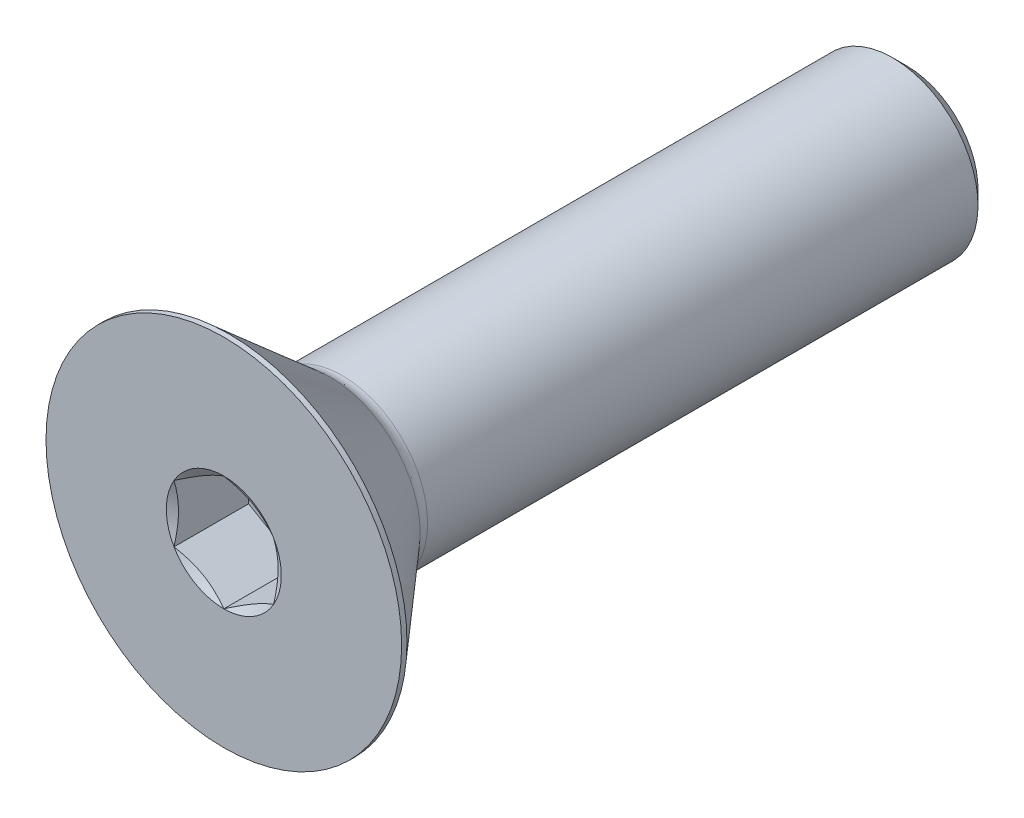
ISO-10303-21;
HEADER;
FILE_DESCRIPTION(('STEP AP214'),'2;1');
FILE_NAME('part.step','',(''),(''),'','','');
FILE_SCHEMA(('AUTOMOTIVE_DESIGN { 1 0 10303 214 1 1 1 1 }'));
ENDSEC;
DATA;
#1=APPLICATION_CONTEXT('core data for automotive mechanical design processes');
#2=APPLICATION_PROTOCOL_DEFINITION('international standard','automotive_design',2000,#1);
#3=PRODUCT_CONTEXT('',#1,'mechanical');
#4=PRODUCT('Part','Part','',(#3));
#5=PRODUCT_RELATED_PRODUCT_CATEGORY('part','',(#4));
#6=PRODUCT_DEFINITION_FORMATION('','',#4);
#7=PRODUCT_DEFINITION_CONTEXT('part definition',#1,'design');
#8=PRODUCT_DEFINITION('design','',#6,#7);
#9=PRODUCT_DEFINITION_SHAPE('','',#8);
#10=(LENGTH_UNIT() NAMED_UNIT(*) SI_UNIT(.MILLI.,.METRE.));
#11=(NAMED_UNIT(*) PLANE_ANGLE_UNIT() SI_UNIT($,.RADIAN.));
#12=(NAMED_UNIT(*) SI_UNIT($,.STERADIAN.) SOLID_ANGLE_UNIT());
#13=UNCERTAINTY_MEASURE_WITH_UNIT(LENGTH_MEASURE(1.E-05),#10,'distance_accuracy_value','');
#14=(GEOMETRIC_REPRESENTATION_CONTEXT(3) GLOBAL_UNCERTAINTY_ASSIGNED_CONTEXT((#13)) GLOBAL_UNIT_ASSIGNED_CONTEXT((#10,
#11,#12)) REPRESENTATION_CONTEXT('',''));
#15=CARTESIAN_POINT('',(0.,0.,0.));
#16=DIRECTION('',(0.,0.,1.));
#17=DIRECTION('',(1.,0.,0.));
#18=AXIS2_PLACEMENT_3D('',#15,#16,#17);
#19=CARTESIAN_POINT('',(0.,0.,-38.1));
#20=DIRECTION('',(0.,0.,-1.));
#21=DIRECTION('',(0.,1.,0.));
#22=AXIS2_PLACEMENT_3D('',#19,#20,#21);
#23=CYLINDRICAL_SURFACE('',#22,4.7625);
#24=CARTESIAN_POINT('',(0.,0.,-37.30625));
#25=DIRECTION('',(0.,0.,-1.));
#26=DIRECTION('',(0.,1.,0.));
#27=AXIS2_PLACEMENT_3D('',#24,#25,#26);
#28=CIRCLE('',#27,4.7625);
#29=CARTESIAN_POINT('',(0.,4.7625,-37.30625));
#30=VERTEX_POINT('',#29);
#31=EDGE_CURVE('E50',#30,#30,#28,.F.);
#32=ORIENTED_EDGE('',*,*,#31,.T.);
#33=EDGE_LOOP('',(#32));
#34=FACE_BOUND('',#33,.T.);
#35=CARTESIAN_POINT('',(0.,0.,-6.60648348108084));
#36=DIRECTION('',(0.,0.,1.));
#37=DIRECTION('',(0.,-1.,0.));
#38=AXIS2_PLACEMENT_3D('',#35,#36,#37);
#39=CIRCLE('',#38,4.7625);
#40=CARTESIAN_POINT('',(0.,-4.7625,-6.60648348108084));
#41=VERTEX_POINT('',#40);
#42=EDGE_CURVE('E209',#41,#41,#39,.T.);
#43=ORIENTED_EDGE('',*,*,#42,.F.);
#44=EDGE_LOOP('',(#43));
#45=FACE_BOUND('',#44,.T.);
#46=ADVANCED_FACE('F37',(#34,#45),#23,.T.);
#47=CARTESIAN_POINT('',(0.,-4.7625,-38.1));
#48=DIRECTION('',(0.,0.,-1.));
#49=DIRECTION('',(0.,1.,0.));
#50=AXIS2_PLACEMENT_3D('',#47,#48,#49);
#51=PLANE('',#50);
#52=CARTESIAN_POINT('',(0.,0.,-38.1));
#53=DIRECTION('',(0.,0.,-1.));
#54=DIRECTION('',(0.,1.,0.));
#55=AXIS2_PLACEMENT_3D('',#52,#53,#54);
#56=CIRCLE('',#55,3.96875);
#57=CARTESIAN_POINT('',(0.,3.96875,-38.1));
#58=VERTEX_POINT('',#57);
#59=EDGE_CURVE('E212',#58,#58,#56,.T.);
#60=ORIENTED_EDGE('',*,*,#59,.T.);
#61=EDGE_LOOP('',(#60));
#62=FACE_BOUND('',#61,.T.);
#63=ADVANCED_FACE('F222',(#62),#51,.T.);
#64=CARTESIAN_POINT('',(0.,0.,-38.1));
#65=DIRECTION('',(0.,0.,1.));
#66=DIRECTION('',(0.,-1.,0.));
#67=AXIS2_PLACEMENT_3D('',#64,#65,#66);
#68=CONICAL_SURFACE('',#67,3.96875,0.785398163397452);
#69=ORIENTED_EDGE('',*,*,#31,.F.);
#70=EDGE_LOOP('',(#69));
#71=FACE_BOUND('',#70,.T.);
#72=ORIENTED_EDGE('',*,*,#59,.F.);
#73=EDGE_LOOP('',(#72));
#74=FACE_BOUND('',#73,.T.);
#75=ADVANCED_FACE('F39',(#71,#74),#68,.T.);
#76=CARTESIAN_POINT('',(0.,0.,-6.60648348108084));
#77=DIRECTION('',(0.,0.,1.));
#78=DIRECTION('',(0.,-1.,0.));
#79=AXIS2_PLACEMENT_3D('',#76,#77,#78);
#80=TOROIDAL_SURFACE('',#79,5.77290219216377,1.01040219216376);
#81=CARTESIAN_POINT('',(0.,0.,-5.9436));
#82=DIRECTION('',(0.,0.,1.));
#83=DIRECTION('',(0.,-1.,0.));
#84=AXIS2_PLACEMENT_3D('',#81,#82,#83);
#85=CIRCLE('',#84,5.01034197785968);
#86=CARTESIAN_POINT('',(0.,-5.01034197785968,-5.9436));
#87=VERTEX_POINT('',#86);
#88=EDGE_CURVE('E206',#87,#87,#85,.T.);
#89=ORIENTED_EDGE('',*,*,#88,.F.);
#90=EDGE_LOOP('',(#89));
#91=FACE_BOUND('',#90,.T.);
#92=ORIENTED_EDGE('',*,*,#42,.T.);
#93=EDGE_LOOP('',(#92));
#94=FACE_BOUND('',#93,.T.);
#95=ADVANCED_FACE('F221',(#91,#94),#80,.F.);
#96=CARTESIAN_POINT('',(0.,0.,-5.9436));
#97=DIRECTION('',(0.,0.,1.));
#98=DIRECTION('',(0.,-1.,0.));
#99=AXIS2_PLACEMENT_3D('',#96,#97,#98);
#100=CONICAL_SURFACE('',#99,5.01034197785968,0.715584993317677);
#101=CARTESIAN_POINT('',(0.,0.,-0.297179999999999));
#102=DIRECTION('',(0.,0.,1.));
#103=DIRECTION('',(0.,-1.,0.));
#104=AXIS2_PLACEMENT_3D('',#101,#102,#103);
#105=CIRCLE('',#104,9.9187);
#106=CARTESIAN_POINT('',(0.,-9.9187,-0.297179999999999));
#107=VERTEX_POINT('',#106);
#108=EDGE_CURVE('E203',#107,#107,#105,.T.);
#109=ORIENTED_EDGE('',*,*,#108,.F.);
#110=EDGE_LOOP('',(#109));
#111=FACE_BOUND('',#110,.T.);
#112=ORIENTED_EDGE('',*,*,#88,.T.);
#113=EDGE_LOOP('',(#112));
#114=FACE_BOUND('',#113,.T.);
#115=ADVANCED_FACE('F234',(#111,#114),#100,.T.);
#116=CARTESIAN_POINT('',(0.,0.,0.));
#117=DIRECTION('',(0.,0.,1.));
#118=DIRECTION('',(0.,-1.,0.));
#119=AXIS2_PLACEMENT_3D('',#116,#117,#118);
#120=CYLINDRICAL_SURFACE('',#119,9.9187);
#121=CARTESIAN_POINT('',(0.,0.,0.));
#122=DIRECTION('',(0.,0.,1.));
#123=DIRECTION('',(0.,-1.,0.));
#124=AXIS2_PLACEMENT_3D('',#121,#122,#123);
#125=CIRCLE('',#124,9.9187);
#126=CARTESIAN_POINT('',(0.,-9.9187,0.));
#127=VERTEX_POINT('',#126);
#128=EDGE_CURVE('E191',#127,#127,#125,.T.);
#129=ORIENTED_EDGE('',*,*,#128,.F.);
#130=EDGE_LOOP('',(#129));
#131=FACE_BOUND('',#130,.T.);
#132=ORIENTED_EDGE('',*,*,#108,.T.);
#133=EDGE_LOOP('',(#132));
#134=FACE_BOUND('',#133,.T.);
#135=ADVANCED_FACE('F166',(#131,#134),#120,.T.);
#136=CARTESIAN_POINT('',(0.,-4.7625,0.));
#137=DIRECTION('',(0.,0.,1.));
#138=DIRECTION('',(0.,-1.,0.));
#139=AXIS2_PLACEMENT_3D('',#136,#137,#138);
#140=PLANE('',#139);
#141=CARTESIAN_POINT('',(0.,0.,0.));
#142=DIRECTION('',(0.,0.,1.));
#143=DIRECTION('',(1.,0.,0.));
#144=AXIS2_PLACEMENT_3D('',#141,#142,#143);
#145=CIRCLE('',#144,3.20790243318486);
#146=CARTESIAN_POINT('',(0.,-3.20790243318486,0.));
#147=VERTEX_POINT('',#146);
#148=CARTESIAN_POINT('',(2.778125,-1.60395121659243,0.));
#149=VERTEX_POINT('',#148);
#150=EDGE_CURVE('E63',#147,#149,#145,.T.);
#151=ORIENTED_EDGE('',*,*,#150,.F.);
#152=CARTESIAN_POINT('',(-2.778125,-1.60395121659243,0.));
#153=VERTEX_POINT('',#152);
#154=EDGE_CURVE('E135',#153,#147,#145,.T.);
#155=ORIENTED_EDGE('',*,*,#154,.F.);
#156=CARTESIAN_POINT('',(-2.778125,1.60395121659243,0.));
#157=VERTEX_POINT('',#156);
#158=EDGE_CURVE('E134',#157,#153,#145,.T.);
#159=ORIENTED_EDGE('',*,*,#158,.F.);
#160=CARTESIAN_POINT('',(0.,3.20790243318486,0.));
#161=VERTEX_POINT('',#160);
#162=EDGE_CURVE('E104',#161,#157,#145,.T.);
#163=ORIENTED_EDGE('',*,*,#162,.F.);
#164=CARTESIAN_POINT('',(2.778125,1.60395121659243,0.));
#165=VERTEX_POINT('',#164);
#166=EDGE_CURVE('E95',#165,#161,#145,.T.);
#167=ORIENTED_EDGE('',*,*,#166,.F.);
#168=EDGE_CURVE('E56',#149,#165,#145,.T.);
#169=ORIENTED_EDGE('',*,*,#168,.F.);
#170=EDGE_LOOP('',(#151,#155,#159,#163,#167,#169));
#171=FACE_BOUND('',#170,.T.);
#172=ORIENTED_EDGE('',*,*,#128,.T.);
#173=EDGE_LOOP('',(#172));
#174=FACE_BOUND('',#173,.T.);
#175=ADVANCED_FACE('F130',(#171,#174),#140,.T.);
#176=CARTESIAN_POINT('',(0.,0.,0.));
#177=DIRECTION('',(0.,0.,1.));
#178=DIRECTION('',(1.,0.,0.));
#179=AXIS2_PLACEMENT_3D('',#176,#177,#178);
#180=CONICAL_SURFACE('',#179,3.20790243318486,1.0471975511966);
#181=ORIENTED_EDGE('',*,*,#162,.T.);
#182=CARTESIAN_POINT('',(0.000199999999999609,3.2080179032387,6.66702660872688E-05));
#183=CARTESIAN_POINT('',(-0.121885144076702,3.13753201244196,-0.0406445247465566));
#184=CARTESIAN_POINT('',(-0.245024117929761,3.06643769274016,-0.0776700622303591));
#185=CARTESIAN_POINT('',(-0.493434409720683,2.9230179439052,-0.142298945307953));
#186=CARTESIAN_POINT('',(-0.618710142029986,2.85068996613349,-0.169879426827812));
#187=CARTESIAN_POINT('',(-0.867709025938613,2.70693039348093,-0.212813060883987));
#188=CARTESIAN_POINT('',(-0.991393862856159,2.63552091959191,-0.228451949340001));
#189=CARTESIAN_POINT('',(-1.239345607797,2.49236591290428,-0.24712256680238));
#190=CARTESIAN_POINT('',(-1.36361161439692,2.42062090054269,-0.250169755595147));
#191=CARTESIAN_POINT('',(-1.5958156778567,2.28655782199727,-0.243835390450094));
#192=CARTESIAN_POINT('',(-1.70378846954637,2.22421970165008,-0.236009139474607));
#193=CARTESIAN_POINT('',(-1.91903060056851,2.0999495993635,-0.211203012458143));
#194=CARTESIAN_POINT('',(-2.02629919524857,2.03801804734938,-0.194214660079117));
#195=CARTESIAN_POINT('',(-2.24198522575482,1.91349165957615,-0.151744501188129));
#196=CARTESIAN_POINT('',(-2.35037535875914,1.85091258710861,-0.126082639289524));
#197=CARTESIAN_POINT('',(-2.56553887729543,1.72668787176189,-0.0678400768565496));
#198=CARTESIAN_POINT('',(-2.67231502005523,1.6650406369965,-0.0352730640752938));
#199=CARTESIAN_POINT('',(-2.778325,1.60383574653859,6.66702660876691E-05));
#200=B_SPLINE_CURVE_WITH_KNOTS('',3,(#182,#183,#184,#185,#186,#187,#188,#189,#190,#191,#192,
#193,#194,#195,#196,#197,#198,#199),.UNSPECIFIED.,.F.,.F.,(4,2,2,2,2,2,2,2,4),(0.,
0.440370866380212,0.881800345151662,1.31230426973359,1.74227947460334,2.11668803119865,
2.49144356837225,2.87451254078227,3.25682915652788),.UNSPECIFIED.);
#201=EDGE_CURVE('E11',#161,#157,#200,.T.);
#202=ORIENTED_EDGE('',*,*,#201,.F.);
#203=EDGE_LOOP('',(#181,#202));
#204=FACE_BOUND('',#203,.T.);
#205=ADVANCED_FACE('F108',(#204),#180,.F.);
#206=ORIENTED_EDGE('',*,*,#158,.T.);
#207=CARTESIAN_POINT('',(-2.778125,-4.15370004048309,1.03300491152933));
#208=CARTESIAN_POINT('',(-2.778125,-4.03373103342448,0.975448321604844));
#209=CARTESIAN_POINT('',(-2.778125,-3.91346976547428,0.918489560441135));
#210=CARTESIAN_POINT('',(-2.778125,-3.6722069445089,0.8061068357562));
#211=CARTESIAN_POINT('',(-2.778125,-3.55120526301331,0.750683148393289));
#212=CARTESIAN_POINT('',(-2.778125,-3.3076120550254,0.641400081905494));
#213=CARTESIAN_POINT('',(-2.778125,-3.18501533694986,0.587552231345589));
#214=CARTESIAN_POINT('',(-2.778125,-2.93879314554029,0.482271200866867));
#215=CARTESIAN_POINT('',(-2.778125,-2.8151677260579,0.430837895473297));
#216=CARTESIAN_POINT('',(-2.778125,-2.56343496826416,0.329719219634367));
#217=CARTESIAN_POINT('',(-2.778125,-2.43529495708381,0.280114709840701));
#218=CARTESIAN_POINT('',(-2.778125,-2.17746499580042,0.185029855355363));
#219=CARTESIAN_POINT('',(-2.778125,-2.04777486803018,0.139549988642197));
#220=CARTESIAN_POINT('',(-2.778125,-1.78693214173661,0.0540131046198155));
#221=CARTESIAN_POINT('',(-2.778125,-1.65578362455305,0.0139437754294577));
#222=CARTESIAN_POINT('',(-2.778125,-1.3916185756433,-0.0593959946531367));
#223=CARTESIAN_POINT('',(-2.778125,-1.25860268787307,-0.0926687206301224));
#224=CARTESIAN_POINT('',(-2.778125,-0.990962789645452,-0.150647436528984));
#225=CARTESIAN_POINT('',(-2.778125,-0.856342584453476,-0.175370650882036));
#226=CARTESIAN_POINT('',(-2.778125,-0.585596062578851,-0.214629397906442));
#227=CARTESIAN_POINT('',(-2.778125,-0.449469848306738,-0.229165619033291));
#228=CARTESIAN_POINT('',(-2.778125,-0.17809603500756,-0.246701702805161));
#229=CARTESIAN_POINT('',(-2.778125,-0.0428574507828105,-0.249837702264235));
#230=CARTESIAN_POINT('',(-2.778125,0.227408323784471,-0.244657481346586));
#231=CARTESIAN_POINT('',(-2.778125,0.362435500519209,-0.236340551847964));
#232=CARTESIAN_POINT('',(-2.778125,0.596249614597465,-0.212582854669035));
#233=CARTESIAN_POINT('',(-2.778125,0.695295016238925,-0.199568653168576));
#234=CARTESIAN_POINT('',(-2.778125,0.892556247899895,-0.168273403912013));
#235=CARTESIAN_POINT('',(-2.778125,0.99077194208797,-0.149991510345153));
#236=CARTESIAN_POINT('',(-2.778125,1.28409841316421,-0.0882168584829494));
#237=CARTESIAN_POINT('',(-2.778125,1.47776360689429,-0.0378093941903987));
#238=CARTESIAN_POINT('',(-2.778125,1.76732785523563,0.0483014668062439));
#239=CARTESIAN_POINT('',(-2.778125,1.86475358534864,0.0791524109903018));
#240=CARTESIAN_POINT('',(-2.778125,2.05865758297007,0.143726854423112));
#241=CARTESIAN_POINT('',(-2.778125,2.15513584367164,0.177450374292346));
#242=CARTESIAN_POINT('',(-2.778125,2.34718346637498,0.247256623478006));
#243=CARTESIAN_POINT('',(-2.778125,2.44275317809753,0.2833383991296));
#244=CARTESIAN_POINT('',(-2.778125,2.63312228312583,0.357470030400658));
#245=CARTESIAN_POINT('',(-2.778125,2.72792168910736,0.395519853558679));
#246=CARTESIAN_POINT('',(-2.778125,2.96990913551657,0.495085369446043));
#247=CARTESIAN_POINT('',(-2.778125,3.11661292903255,0.557776475957478));
#248=CARTESIAN_POINT('',(-2.778125,3.40869880892585,0.68617459182908));
#249=CARTESIAN_POINT('',(-2.778125,3.55408079565145,0.751881826354663));
#250=CARTESIAN_POINT('',(-2.778125,3.84380576249536,0.885631629330957));
#251=CARTESIAN_POINT('',(-2.778125,3.98814848588996,0.953674752374367));
#252=CARTESIAN_POINT('',(-2.778125,4.27596459915694,1.09157823706017));
#253=CARTESIAN_POINT('',(-2.778125,4.41943796960625,1.16143863912098));
#254=CARTESIAN_POINT('',(-2.778125,4.84913877725405,1.37332380161613));
#255=CARTESIAN_POINT('',(-2.778125,5.13430753978909,1.51749350337971));
#256=CARTESIAN_POINT('',(-2.778125,5.70268767501559,1.80951752426793));
#257=CARTESIAN_POINT('',(-2.778125,5.98589932280811,1.95737131150662));
#258=CARTESIAN_POINT('',(-2.778125,6.52430409463129,2.24156227903238));
#259=CARTESIAN_POINT('',(-2.778125,6.77961886434073,2.37766936954704));
#260=CARTESIAN_POINT('',(-2.778125,7.28942859785324,2.65143388512339));
#261=CARTESIAN_POINT('',(-2.778125,7.54392352629557,2.78909137593417));
#262=CARTESIAN_POINT('',(-2.778125,8.0516340939873,3.06521693386118));
#263=CARTESIAN_POINT('',(-2.778125,8.30485134068065,3.20368204865877));
#264=CARTESIAN_POINT('',(-2.778125,8.81077252104128,3.48151273791932));
#265=CARTESIAN_POINT('',(-2.778125,9.06347648350061,3.62087825993271));
#266=CARTESIAN_POINT('',(-2.778125,9.3159965362474,3.76057408774028));
#267=B_SPLINE_CURVE_WITH_KNOTS('',3,(#207,#208,#209,#210,#211,#212,#213,#214,#215,#216,#217,
#218,#219,#220,#221,#222,#223,#224,#225,#226,#227,#228,#229,#230,#231,#232,#233,#234,#235,#236,
#237,#238,#239,#240,#241,#242,#243,#244,#245,#246,#247,#248,#249,#250,#251,#252,#253,#254,#255,
#256,#257,#258,#259,#260,#261,#262,#263,#264,#265,#266),.UNSPECIFIED.,.F.,.F.,(4,2,2,2,2,2,2,2,
2,2,2,2,2,2,2,2,2,2,2,2,2,2,2,2,2,2,2,2,2,4),(0.,0.39918973365978,0.798450820768392,
1.20013384017496,1.6017959624794,2.01395982062558,2.42617138093706,2.83742853533285,
3.24854719262676,3.65883268959747,4.06909045605489,4.47443269335486,4.87980002903635,
5.17934220647272,5.47893250694109,6.07848879020257,6.38504829967998,6.69161000994791,
6.99804850645995,7.30448195011338,7.78304515889336,8.26164415252432,8.74035757310083,
9.21908164994437,10.1776538992522,11.136088548529,12.0040657235321,12.8720798472002,
13.7378861439126,14.6036424533182),.UNSPECIFIED.);
#268=EDGE_CURVE('E103',#157,#153,#267,.F.);
#269=ORIENTED_EDGE('',*,*,#268,.F.);
#270=EDGE_LOOP('',(#206,#269));
#271=FACE_BOUND('',#270,.T.);
#272=ADVANCED_FACE('F262',(#271),#180,.F.);
#273=ORIENTED_EDGE('',*,*,#154,.T.);
#274=CARTESIAN_POINT('',(-2.778325,-1.60383574653859,6.66702660873426E-05));
#275=CARTESIAN_POINT('',(-2.6562398559233,-1.67432163733533,-0.0406445247465566));
#276=CARTESIAN_POINT('',(-2.53310088207024,-1.74541595703713,-0.0776700622303591));
#277=CARTESIAN_POINT('',(-2.28469059027932,-1.88883570587209,-0.142298945307953));
#278=CARTESIAN_POINT('',(-2.15941485797001,-1.96116368364379,-0.169879426827812));
#279=CARTESIAN_POINT('',(-1.91041597406139,-2.10492325629636,-0.212813060883987));
#280=CARTESIAN_POINT('',(-1.78673113714384,-2.17633273018538,-0.22845194934));
#281=CARTESIAN_POINT('',(-1.538779392203,-2.31948773687301,-0.24712256680238));
#282=CARTESIAN_POINT('',(-1.41451338560308,-2.39123274923459,-0.250169755595148));
#283=CARTESIAN_POINT('',(-1.1823093221433,-2.52529582778002,-0.243835390450094));
#284=CARTESIAN_POINT('',(-1.07433653045363,-2.5876339481272,-0.236009139474607));
#285=CARTESIAN_POINT('',(-0.859094399431488,-2.71190405041379,-0.211203012458144));
#286=CARTESIAN_POINT('',(-0.751825804751433,-2.77383560242791,-0.194214660079117));
#287=CARTESIAN_POINT('',(-0.536139774245179,-2.89836199020114,-0.15174450118813));
#288=CARTESIAN_POINT('',(-0.427749641240864,-2.96094106266868,-0.126082639289525));
#289=CARTESIAN_POINT('',(-0.212586122704572,-3.08516577801539,-0.0678400768565507));
#290=CARTESIAN_POINT('',(-0.105809979944775,-3.14681301278079,-0.0352730640752949));
#291=CARTESIAN_POINT('',(0.000199999999999635,-3.2080179032387,6.66702660868094E-05));
#292=B_SPLINE_CURVE_WITH_KNOTS('',3,(#274,#275,#276,#277,#278,#279,#280,#281,#282,#283,#284,
#285,#286,#287,#288,#289,#290,#291),.UNSPECIFIED.,.F.,.F.,(4,2,2,2,2,2,2,2,4),(0.,
0.440370866380212,0.881800345151662,1.31230426973359,1.74227947460334,2.11668803119865,
2.49144356837225,2.87451254078227,3.25682915652788),.UNSPECIFIED.);
#293=EDGE_CURVE('E143',#153,#147,#292,.T.);
#294=ORIENTED_EDGE('',*,*,#293,.F.);
#295=EDGE_LOOP('',(#273,#294));
#296=FACE_BOUND('',#295,.T.);
#297=ADVANCED_FACE('F268',(#296),#180,.F.);
#298=ORIENTED_EDGE('',*,*,#150,.T.);
#299=CARTESIAN_POINT('',(-0.000200000000000051,-3.2080179032387,6.6670266086768E-05));
#300=CARTESIAN_POINT('',(0.121885144076702,-3.13753201244196,-0.0406445247465573));
#301=CARTESIAN_POINT('',(0.245024117929761,-3.06643769274016,-0.0776700622303597));
#302=CARTESIAN_POINT('',(0.493434409720683,-2.9230179439052,-0.142298945307953));
#303=CARTESIAN_POINT('',(0.618710142029985,-2.85068996613349,-0.169879426827812));
#304=CARTESIAN_POINT('',(0.867709025938612,-2.70693039348093,-0.212813060883987));
#305=CARTESIAN_POINT('',(0.991393862856158,-2.63552091959191,-0.228451949340001));
#306=CARTESIAN_POINT('',(1.239345607797,-2.49236591290428,-0.24712256680238));
#307=CARTESIAN_POINT('',(1.36361161439692,-2.42062090054269,-0.250169755595147));
#308=CARTESIAN_POINT('',(1.5958156778567,-2.28655782199727,-0.243835390450094));
#309=CARTESIAN_POINT('',(1.70378846954637,-2.22421970165008,-0.236009139474607));
#310=CARTESIAN_POINT('',(1.91903060056851,-2.0999495993635,-0.211203012458144));
#311=CARTESIAN_POINT('',(2.02629919524857,-2.03801804734938,-0.194214660079117));
#312=CARTESIAN_POINT('',(2.24198522575482,-1.91349165957615,-0.15174450118813));
#313=CARTESIAN_POINT('',(2.35037535875914,-1.85091258710861,-0.126082639289524));
#314=CARTESIAN_POINT('',(2.56553887729543,-1.72668787176189,-0.0678400768565502));
#315=CARTESIAN_POINT('',(2.67231502005522,-1.66504063699649,-0.0352730640752944));
#316=CARTESIAN_POINT('',(2.778325,-1.60383574653859,6.66702660873105E-05));
#317=B_SPLINE_CURVE_WITH_KNOTS('',3,(#299,#300,#301,#302,#303,#304,#305,#306,#307,#308,#309,
#310,#311,#312,#313,#314,#315,#316),.UNSPECIFIED.,.F.,.F.,(4,2,2,2,2,2,2,2,4),(0.,
0.440370866380212,0.881800345151662,1.31230426973359,1.74227947460334,2.11668803119865,
2.49144356837225,2.87451254078227,3.25682915652788),.UNSPECIFIED.);
#318=EDGE_CURVE('E391',#147,#149,#317,.T.);
#319=ORIENTED_EDGE('',*,*,#318,.F.);
#320=EDGE_LOOP('',(#298,#319));
#321=FACE_BOUND('',#320,.T.);
#322=ADVANCED_FACE('F275',(#321),#180,.F.);
#323=ORIENTED_EDGE('',*,*,#168,.T.);
#324=CARTESIAN_POINT('',(2.778125,-4.15370004197706,1.03300491224629));
#325=CARTESIAN_POINT('',(2.778125,-4.03373103486739,0.975448322290919));
#326=CARTESIAN_POINT('',(2.778125,-3.9134697668661,0.918489561096342));
#327=CARTESIAN_POINT('',(2.778125,-3.67220694579834,0.806106836349845));
#328=CARTESIAN_POINT('',(2.778125,-3.55120526425147,0.750683148956242));
#329=CARTESIAN_POINT('',(2.778125,-3.30761205616003,0.641400082407017));
#330=CARTESIAN_POINT('',(2.778125,-3.18501533803222,0.587552231816382));
#331=CARTESIAN_POINT('',(2.778125,-2.93879314651772,0.482271201276803));
#332=CARTESIAN_POINT('',(2.778125,-2.81516772698266,0.430837895853103));
#333=CARTESIAN_POINT('',(2.778125,-2.56343496908051,0.329719219953724));
#334=CARTESIAN_POINT('',(2.778125,-2.43529495784439,0.28011471012979));
#335=CARTESIAN_POINT('',(2.778125,-2.17746499644849,0.185029855585765));
#336=CARTESIAN_POINT('',(2.778125,-2.04777486862149,0.139549988844179));
#337=CARTESIAN_POINT('',(2.778125,-1.78693214221334,0.054013104768088));
#338=CARTESIAN_POINT('',(2.778125,-1.65578362497196,0.0139437755524265));
#339=CARTESIAN_POINT('',(2.778125,-1.39161857594493,-0.059395994576055));
#340=CARTESIAN_POINT('',(2.778125,-1.25860268811526,-0.0926687205736275));
#341=CARTESIAN_POINT('',(2.778125,-0.990962789750269,-0.150647436510293));
#342=CARTESIAN_POINT('',(2.778125,-0.856342584480141,-0.175370650879515));
#343=CARTESIAN_POINT('',(2.778125,-0.585596062447575,-0.214629397924134));
#344=CARTESIAN_POINT('',(2.778125,-0.449469848095675,-0.229165619055036));
#345=CARTESIAN_POINT('',(2.778125,-0.178096034638406,-0.246701702821013));
#346=CARTESIAN_POINT('',(2.778125,-0.042857450335361,-0.249837702270374));
#347=CARTESIAN_POINT('',(2.778125,0.227408324387047,-0.244657481320322));
#348=CARTESIAN_POINT('',(2.778125,0.362435501198615,-0.236340551799008));
#349=CARTESIAN_POINT('',(2.778125,0.596249615377041,-0.212582854574931));
#350=CARTESIAN_POINT('',(2.778125,0.695295017042667,-0.199568653056148));
#351=CARTESIAN_POINT('',(2.778125,0.892556248751006,-0.16827340376191));
#352=CARTESIAN_POINT('',(2.778125,0.990771942962284,-0.149991510175699));
#353=CARTESIAN_POINT('',(2.778125,1.28409841410704,-0.0882168582549582));
#354=CARTESIAN_POINT('',(2.778125,1.47776360788126,-0.037809393922769));
#355=CARTESIAN_POINT('',(2.778125,1.76732785628875,0.048301467132633));
#356=CARTESIAN_POINT('',(2.778125,1.86475358642423,0.0791524113364454));
#357=CARTESIAN_POINT('',(2.778125,2.05865758409043,0.143726854808275));
#358=CARTESIAN_POINT('',(2.778125,2.15513584481428,0.177450374696773));
#359=CARTESIAN_POINT('',(2.778125,2.34718346756207,0.247256623920395));
#360=CARTESIAN_POINT('',(2.778125,2.44275317930678,0.283338399590686));
#361=CARTESIAN_POINT('',(2.778125,2.63312228437941,0.357470030898612));
#362=CARTESIAN_POINT('',(2.778125,2.72792169038311,0.395519854074804));
#363=CARTESIAN_POINT('',(2.778125,2.96990913680703,0.495085369990756));
#364=CARTESIAN_POINT('',(2.778125,3.11661293031605,0.55777647651112));
#365=CARTESIAN_POINT('',(2.778125,3.40869881019629,0.686174592398102));
#366=CARTESIAN_POINT('',(2.778125,3.55408079691579,0.751881826930134));
#367=CARTESIAN_POINT('',(2.778125,3.84380576374816,0.885631629917509));
#368=CARTESIAN_POINT('',(2.778125,3.9881484871373,0.953674752965549));
#369=CARTESIAN_POINT('',(2.778125,4.27596460039392,1.09157823765929));
#370=CARTESIAN_POINT('',(2.778125,4.41943797083832,1.16143863972341));
#371=CARTESIAN_POINT('',(2.778125,4.8491387784716,1.37332380222683));
#372=CARTESIAN_POINT('',(2.778125,5.13430754099766,1.5174935039939));
#373=CARTESIAN_POINT('',(2.778125,5.70268767620735,1.80951752488693));
#374=CARTESIAN_POINT('',(2.778125,5.98589932399202,1.95737131212694));
#375=CARTESIAN_POINT('',(2.778125,6.52430409580807,2.24156227965769));
#376=CARTESIAN_POINT('',(2.778125,6.77961886551813,2.3776693701762));
#377=CARTESIAN_POINT('',(2.778125,7.28942859903219,2.65143388575957));
#378=CARTESIAN_POINT('',(2.778125,7.54392352747546,2.78909137657352));
#379=CARTESIAN_POINT('',(2.778125,8.05163409517019,3.06521693450687));
#380=CARTESIAN_POINT('',(2.778125,8.30485134186559,3.20368204930763));
#381=CARTESIAN_POINT('',(2.778125,8.81077252223053,3.48151273857421));
#382=CARTESIAN_POINT('',(2.778125,9.06347648469211,3.62087826059046));
#383=CARTESIAN_POINT('',(2.778125,9.31599653744121,3.76057408840078));
#384=B_SPLINE_CURVE_WITH_KNOTS('',3,(#324,#325,#326,#327,#328,#329,#330,#331,#332,#333,#334,
#335,#336,#337,#338,#339,#340,#341,#342,#343,#344,#345,#346,#347,#348,#349,#350,#351,#352,#353,
#354,#355,#356,#357,#358,#359,#360,#361,#362,#363,#364,#365,#366,#367,#368,#369,#370,#371,#372,
#373,#374,#375,#376,#377,#378,#379,#380,#381,#382,#383),.UNSPECIFIED.,.F.,.F.,(4,2,2,2,2,2,2,2,
2,2,2,2,2,2,2,2,2,2,2,2,2,2,2,2,2,2,2,2,2,4),(0.,0.39918973383796,0.798450821124784,
1.20013384071197,1.60179596319703,2.01395982153197,2.42617138203229,2.83742853661603,
3.24854719409771,3.65883269130722,4.06909045800312,4.47443269553638,4.87980003145136,
5.17934220896675,5.47893250951416,6.07848879293392,6.38504830249354,6.69161001284367,
6.99804850943774,7.30448195317322,7.7830451619446,8.2616441555669,8.74035757613456,
9.21908165296922,10.1776539022578,11.1360885515156,12.0040657265257,12.8720798502009,
13.7378861469232,14.603642456339),.UNSPECIFIED.);
#385=EDGE_CURVE('E120',#149,#165,#384,.T.);
#386=ORIENTED_EDGE('',*,*,#385,.F.);
#387=EDGE_LOOP('',(#323,#386));
#388=FACE_BOUND('',#387,.T.);
#389=ADVANCED_FACE('F282',(#388),#180,.F.);
#390=ORIENTED_EDGE('',*,*,#166,.T.);
#391=CARTESIAN_POINT('',(2.778325,1.60383574653859,6.6670266087593E-05));
#392=CARTESIAN_POINT('',(2.6562398559233,1.67432163733533,-0.0406445247465565));
#393=CARTESIAN_POINT('',(2.53310088207024,1.74541595703713,-0.0776700622303591));
#394=CARTESIAN_POINT('',(2.28469059027932,1.88883570587209,-0.142298945307953));
#395=CARTESIAN_POINT('',(2.15941485797001,1.96116368364379,-0.169879426827812));
#396=CARTESIAN_POINT('',(1.91041597406139,2.10492325629636,-0.212813060883987));
#397=CARTESIAN_POINT('',(1.78673113714384,2.17633273018538,-0.22845194934));
#398=CARTESIAN_POINT('',(1.538779392203,2.31948773687301,-0.24712256680238));
#399=CARTESIAN_POINT('',(1.41451338560308,2.39123274923459,-0.250169755595147));
#400=CARTESIAN_POINT('',(1.1823093221433,2.52529582778002,-0.243835390450094));
#401=CARTESIAN_POINT('',(1.07433653045363,2.5876339481272,-0.236009139474607));
#402=CARTESIAN_POINT('',(0.859094399431487,2.71190405041379,-0.211203012458144));
#403=CARTESIAN_POINT('',(0.751825804751432,2.77383560242791,-0.194214660079117));
#404=CARTESIAN_POINT('',(0.536139774245178,2.89836199020114,-0.15174450118813));
#405=CARTESIAN_POINT('',(0.427749641240864,2.96094106266868,-0.126082639289524));
#406=CARTESIAN_POINT('',(0.212586122704572,3.08516577801539,-0.0678400768565503));
#407=CARTESIAN_POINT('',(0.105809979944775,3.14681301278079,-0.0352730640752945));
#408=CARTESIAN_POINT('',(-0.000200000000000393,3.2080179032387,6.66702660871695E-05));
#409=B_SPLINE_CURVE_WITH_KNOTS('',3,(#391,#392,#393,#394,#395,#396,#397,#398,#399,#400,#401,
#402,#403,#404,#405,#406,#407,#408),.UNSPECIFIED.,.F.,.F.,(4,2,2,2,2,2,2,2,4),(0.,
0.440370866380212,0.881800345151662,1.31230426973359,1.74227947460334,2.11668803119865,
2.49144356837225,2.87451254078227,3.25682915652788),.UNSPECIFIED.);
#410=EDGE_CURVE('E99',#165,#161,#409,.T.);
#411=ORIENTED_EDGE('',*,*,#410,.F.);
#412=EDGE_LOOP('',(#390,#411));
#413=FACE_BOUND('',#412,.T.);
#414=ADVANCED_FACE('F97',(#413),#180,.F.);
#415=CARTESIAN_POINT('',(0.,3.20790243318486,-4.16052));
#416=DIRECTION('',(0.,0.,1.));
#417=DIRECTION('',(1.,0.,0.));
#418=AXIS2_PLACEMENT_3D('',#415,#416,#417);
#419=PLANE('',#418);
#420=DIRECTION('',(-0.866025403784439,0.5,0.));
#421=VECTOR('',#420,1.);
#422=CARTESIAN_POINT('',(2.778125,1.60395121659243,-4.16052));
#423=LINE('',#422,#421);
#424=CARTESIAN_POINT('',(2.778125,1.60395121659243,-4.16052));
#425=VERTEX_POINT('',#424);
#426=CARTESIAN_POINT('',(0.,3.20790243318486,-4.16052));
#427=VERTEX_POINT('',#426);
#428=EDGE_CURVE('E119',#425,#427,#423,.T.);
#429=ORIENTED_EDGE('',*,*,#428,.T.);
#430=DIRECTION('',(-0.866025403784439,-0.5,0.));
#431=VECTOR('',#430,1.);
#432=CARTESIAN_POINT('',(0.,3.20790243318486,-4.16052));
#433=LINE('',#432,#431);
#434=CARTESIAN_POINT('',(-2.778125,1.60395121659243,-4.16052));
#435=VERTEX_POINT('',#434);
#436=EDGE_CURVE('E124',#427,#435,#433,.T.);
#437=ORIENTED_EDGE('',*,*,#436,.T.);
#438=DIRECTION('',(0.,-1.,0.));
#439=VECTOR('',#438,1.);
#440=CARTESIAN_POINT('',(-2.778125,1.60395121659243,-4.16052));
#441=LINE('',#440,#439);
#442=CARTESIAN_POINT('',(-2.778125,-1.60395121659243,-4.16052));
#443=VERTEX_POINT('',#442);
#444=EDGE_CURVE('E179',#435,#443,#441,.T.);
#445=ORIENTED_EDGE('',*,*,#444,.T.);
#446=DIRECTION('',(0.866025403784439,-0.5,0.));
#447=VECTOR('',#446,1.);
#448=CARTESIAN_POINT('',(-2.778125,-1.60395121659243,-4.16052));
#449=LINE('',#448,#447);
#450=CARTESIAN_POINT('',(0.,-3.20790243318486,-4.16052));
#451=VERTEX_POINT('',#450);
#452=EDGE_CURVE('E182',#443,#451,#449,.T.);
#453=ORIENTED_EDGE('',*,*,#452,.T.);
#454=DIRECTION('',(0.866025403784439,0.5,0.));
#455=VECTOR('',#454,1.);
#456=CARTESIAN_POINT('',(0.,-3.20790243318486,-4.16052));
#457=LINE('',#456,#455);
#458=CARTESIAN_POINT('',(2.778125,-1.60395121659243,-4.16052));
#459=VERTEX_POINT('',#458);
#460=EDGE_CURVE('E185',#451,#459,#457,.T.);
#461=ORIENTED_EDGE('',*,*,#460,.T.);
#462=DIRECTION('',(0.,1.,0.));
#463=VECTOR('',#462,1.);
#464=CARTESIAN_POINT('',(2.778125,-1.60395121659243,-4.16052));
#465=LINE('',#464,#463);
#466=EDGE_CURVE('E127',#459,#425,#465,.T.);
#467=ORIENTED_EDGE('',*,*,#466,.T.);
#468=EDGE_LOOP('',(#429,#437,#445,#453,#461,#467));
#469=FACE_BOUND('',#468,.T.);
#470=ADVANCED_FACE('F161',(#469),#419,.T.);
#471=CARTESIAN_POINT('',(0.,3.20790243318486,-4.16052));
#472=DIRECTION('',(-0.5,0.866025403784439,0.));
#473=DIRECTION('',(-0.866025403784439,-0.5,0.));
#474=AXIS2_PLACEMENT_3D('',#471,#472,#473);
#475=PLANE('',#474);
#476=DIRECTION('',(0.,0.,1.));
#477=VECTOR('',#476,1.);
#478=CARTESIAN_POINT('',(0.,3.20790243318486,-4.16052));
#479=LINE('',#478,#477);
#480=EDGE_CURVE('E116',#427,#161,#479,.T.);
#481=ORIENTED_EDGE('',*,*,#480,.T.);
#482=ORIENTED_EDGE('',*,*,#201,.T.);
#483=DIRECTION('',(0.,0.,1.));
#484=VECTOR('',#483,1.);
#485=CARTESIAN_POINT('',(-2.778125,1.60395121659243,-4.16052));
#486=LINE('',#485,#484);
#487=EDGE_CURVE('E126',#435,#157,#486,.T.);
#488=ORIENTED_EDGE('',*,*,#487,.F.);
#489=ORIENTED_EDGE('',*,*,#436,.F.);
#490=EDGE_LOOP('',(#481,#482,#488,#489));
#491=FACE_BOUND('',#490,.T.);
#492=ADVANCED_FACE('F122',(#491),#475,.F.);
#493=CARTESIAN_POINT('',(-2.778125,1.60395121659243,-4.16052));
#494=DIRECTION('',(-1.,0.,0.));
#495=DIRECTION('',(0.,-1.,0.));
#496=AXIS2_PLACEMENT_3D('',#493,#494,#495);
#497=PLANE('',#496);
#498=ORIENTED_EDGE('',*,*,#487,.T.);
#499=ORIENTED_EDGE('',*,*,#268,.T.);
#500=DIRECTION('',(0.,0.,1.));
#501=VECTOR('',#500,1.);
#502=CARTESIAN_POINT('',(-2.778125,-1.60395121659243,-4.16052));
#503=LINE('',#502,#501);
#504=EDGE_CURVE('E198',#443,#153,#503,.T.);
#505=ORIENTED_EDGE('',*,*,#504,.F.);
#506=ORIENTED_EDGE('',*,*,#444,.F.);
#507=EDGE_LOOP('',(#498,#499,#505,#506));
#508=FACE_BOUND('',#507,.T.);
#509=ADVANCED_FACE('F151',(#508),#497,.F.);
#510=CARTESIAN_POINT('',(-2.778125,-1.60395121659243,-4.16052));
#511=DIRECTION('',(-0.5,-0.866025403784439,0.));
#512=DIRECTION('',(0.866025403784439,-0.5,0.));
#513=AXIS2_PLACEMENT_3D('',#510,#511,#512);
#514=PLANE('',#513);
#515=ORIENTED_EDGE('',*,*,#504,.T.);
#516=ORIENTED_EDGE('',*,*,#293,.T.);
#517=DIRECTION('',(0.,0.,1.));
#518=VECTOR('',#517,1.);
#519=CARTESIAN_POINT('',(0.,-3.20790243318486,-4.16052));
#520=LINE('',#519,#518);
#521=EDGE_CURVE('E195',#451,#147,#520,.T.);
#522=ORIENTED_EDGE('',*,*,#521,.F.);
#523=ORIENTED_EDGE('',*,*,#452,.F.);
#524=EDGE_LOOP('',(#515,#516,#522,#523));
#525=FACE_BOUND('',#524,.T.);
#526=ADVANCED_FACE('F154',(#525),#514,.F.);
#527=CARTESIAN_POINT('',(0.,-3.20790243318486,-4.16052));
#528=DIRECTION('',(0.5,-0.866025403784439,0.));
#529=DIRECTION('',(0.866025403784439,0.5,0.));
#530=AXIS2_PLACEMENT_3D('',#527,#528,#529);
#531=PLANE('',#530);
#532=ORIENTED_EDGE('',*,*,#521,.T.);
#533=ORIENTED_EDGE('',*,*,#318,.T.);
#534=DIRECTION('',(0.,0.,1.));
#535=VECTOR('',#534,1.);
#536=CARTESIAN_POINT('',(2.778125,-1.60395121659243,-4.16052));
#537=LINE('',#536,#535);
#538=EDGE_CURVE('E192',#459,#149,#537,.T.);
#539=ORIENTED_EDGE('',*,*,#538,.F.);
#540=ORIENTED_EDGE('',*,*,#460,.F.);
#541=EDGE_LOOP('',(#532,#533,#539,#540));
#542=FACE_BOUND('',#541,.T.);
#543=ADVANCED_FACE('F311',(#542),#531,.F.);
#544=CARTESIAN_POINT('',(2.778125,-1.60395121659243,-4.16052));
#545=DIRECTION('',(1.,0.,0.));
#546=DIRECTION('',(0.,1.,0.));
#547=AXIS2_PLACEMENT_3D('',#544,#545,#546);
#548=PLANE('',#547);
#549=ORIENTED_EDGE('',*,*,#538,.T.);
#550=ORIENTED_EDGE('',*,*,#385,.T.);
#551=DIRECTION('',(0.,0.,1.));
#552=VECTOR('',#551,1.);
#553=CARTESIAN_POINT('',(2.778125,1.60395121659243,-4.16052));
#554=LINE('',#553,#552);
#555=EDGE_CURVE('E118',#425,#165,#554,.T.);
#556=ORIENTED_EDGE('',*,*,#555,.F.);
#557=ORIENTED_EDGE('',*,*,#466,.F.);
#558=EDGE_LOOP('',(#549,#550,#556,#557));
#559=FACE_BOUND('',#558,.T.);
#560=ADVANCED_FACE('F165',(#559),#548,.F.);
#561=CARTESIAN_POINT('',(2.778125,1.60395121659243,-4.16052));
#562=DIRECTION('',(0.5,0.866025403784439,0.));
#563=DIRECTION('',(-0.866025403784439,0.5,0.));
#564=AXIS2_PLACEMENT_3D('',#561,#562,#563);
#565=PLANE('',#564);
#566=ORIENTED_EDGE('',*,*,#555,.T.);
#567=ORIENTED_EDGE('',*,*,#410,.T.);
#568=ORIENTED_EDGE('',*,*,#480,.F.);
#569=ORIENTED_EDGE('',*,*,#428,.F.);
#570=EDGE_LOOP('',(#566,#567,#568,#569));
#571=FACE_BOUND('',#570,.T.);
#572=ADVANCED_FACE('F114',(#571),#565,.F.);
#573=CLOSED_SHELL('',(#46,#63,#75,#95,#115,#135,#175,#205,#272,#297,#322,#389,#414,#470,#492,
#509,#526,#543,#560,#572));
#574=MANIFOLD_SOLID_BREP('B2',#573);
#575=ADVANCED_BREP_SHAPE_REPRESENTATION('',(#18,#574),#14);
#576=SHAPE_DEFINITION_REPRESENTATION(#9,#575);
ENDSEC;
END-ISO-10303-21;
